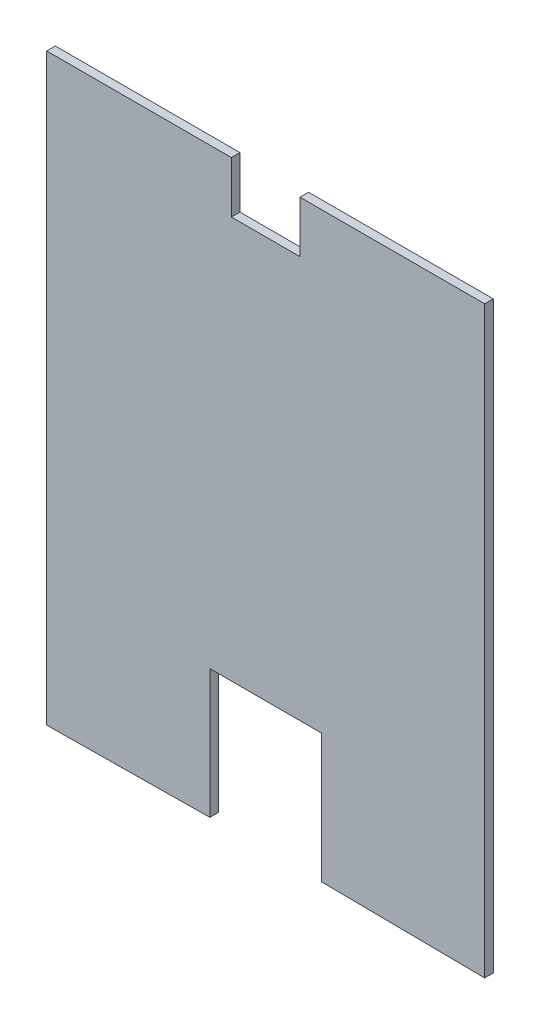
ISO-10303-21;
HEADER;
FILE_DESCRIPTION(('STEP AP214'),'2;1');
FILE_NAME('part.step','',(''),(''),'','','');
FILE_SCHEMA(('AUTOMOTIVE_DESIGN { 1 0 10303 214 1 1 1 1 }'));
ENDSEC;
DATA;
#1=APPLICATION_CONTEXT('core data for automotive mechanical design processes');
#2=APPLICATION_PROTOCOL_DEFINITION('international standard','automotive_design',2000,#1);
#3=PRODUCT_CONTEXT('',#1,'mechanical');
#4=PRODUCT('Part','Part','',(#3));
#5=PRODUCT_RELATED_PRODUCT_CATEGORY('part','',(#4));
#6=PRODUCT_DEFINITION_FORMATION('','',#4);
#7=PRODUCT_DEFINITION_CONTEXT('part definition',#1,'design');
#8=PRODUCT_DEFINITION('design','',#6,#7);
#9=PRODUCT_DEFINITION_SHAPE('','',#8);
#10=(LENGTH_UNIT() NAMED_UNIT(*) SI_UNIT(.MILLI.,.METRE.));
#11=(NAMED_UNIT(*) PLANE_ANGLE_UNIT() SI_UNIT($,.RADIAN.));
#12=(NAMED_UNIT(*) SI_UNIT($,.STERADIAN.) SOLID_ANGLE_UNIT());
#13=UNCERTAINTY_MEASURE_WITH_UNIT(LENGTH_MEASURE(1.E-05),#10,'distance_accuracy_value','');
#14=(GEOMETRIC_REPRESENTATION_CONTEXT(3) GLOBAL_UNCERTAINTY_ASSIGNED_CONTEXT((#13)) GLOBAL_UNIT_ASSIGNED_CONTEXT((#10,
#11,#12)) REPRESENTATION_CONTEXT('',''));
#15=CARTESIAN_POINT('',(0.,0.,0.));
#16=DIRECTION('',(0.,0.,1.));
#17=DIRECTION('',(1.,0.,0.));
#18=AXIS2_PLACEMENT_3D('',#15,#16,#17);
#19=CARTESIAN_POINT('',(-485.570077518931,85.6138901487541,4.99999999999991));
#20=DIRECTION('',(1.,0.,0.));
#21=DIRECTION('',(0.,0.,-1.));
#22=AXIS2_PLACEMENT_3D('',#19,#20,#21);
#23=PLANE('',#22);
#24=DIRECTION('',(0.,-1.,0.));
#25=VECTOR('',#24,1.);
#26=CARTESIAN_POINT('',(-485.570077518931,85.6138901487541,0.));
#27=LINE('',#26,#25);
#28=CARTESIAN_POINT('',(-485.570077518931,85.6138901487541,0.));
#29=VERTEX_POINT('',#28);
#30=CARTESIAN_POINT('',(-485.570077518931,-254.386109851245,0.));
#31=VERTEX_POINT('',#30);
#32=EDGE_CURVE('E153',#29,#31,#27,.T.);
#33=ORIENTED_EDGE('',*,*,#32,.T.);
#34=DIRECTION('',(0.,0.,-1.));
#35=VECTOR('',#34,1.);
#36=CARTESIAN_POINT('',(-485.570077518931,-254.386109851245,4.99999999999991));
#37=LINE('',#36,#35);
#38=CARTESIAN_POINT('',(-485.570077518931,-254.386109851245,4.99999999999991));
#39=VERTEX_POINT('',#38);
#40=EDGE_CURVE('E11',#39,#31,#37,.T.);
#41=ORIENTED_EDGE('',*,*,#40,.F.);
#42=DIRECTION('',(0.,-1.,0.));
#43=VECTOR('',#42,1.);
#44=CARTESIAN_POINT('',(-485.570077518931,85.6138901487541,4.99999999999991));
#45=LINE('',#44,#43);
#46=CARTESIAN_POINT('',(-485.570077518931,85.6138901487541,4.99999999999991));
#47=VERTEX_POINT('',#46);
#48=EDGE_CURVE('E175',#47,#39,#45,.T.);
#49=ORIENTED_EDGE('',*,*,#48,.F.);
#50=DIRECTION('',(0.,0.,-1.));
#51=VECTOR('',#50,1.);
#52=CARTESIAN_POINT('',(-485.570077518931,85.6138901487541,4.99999999999991));
#53=LINE('',#52,#51);
#54=EDGE_CURVE('E149',#47,#29,#53,.T.);
#55=ORIENTED_EDGE('',*,*,#54,.T.);
#56=EDGE_LOOP('',(#33,#41,#49,#55));
#57=FACE_BOUND('',#56,.T.);
#58=ADVANCED_FACE('F33',(#57),#23,.F.);
#59=CARTESIAN_POINT('',(-485.570077518931,-254.386109851245,4.99999999999991));
#60=DIRECTION('',(-0.0105257326625402,0.999944602941541,0.));
#61=DIRECTION('',(-0.999944602941541,-0.0105257326625402,0.));
#62=AXIS2_PLACEMENT_3D('',#59,#60,#61);
#63=PLANE('',#62);
#64=DIRECTION('',(0.999944602941541,0.0105257326625402,0.));
#65=VECTOR('',#64,1.);
#66=CARTESIAN_POINT('',(-485.570077518931,-254.386109851245,0.));
#67=LINE('',#66,#65);
#68=CARTESIAN_POINT('',(-390.570077518931,-253.386109851245,0.));
#69=VERTEX_POINT('',#68);
#70=EDGE_CURVE('E156',#31,#69,#67,.T.);
#71=ORIENTED_EDGE('',*,*,#70,.T.);
#72=DIRECTION('',(0.,0.,-1.));
#73=VECTOR('',#72,1.);
#74=CARTESIAN_POINT('',(-390.570077518931,-253.386109851245,4.99999999999991));
#75=LINE('',#74,#73);
#76=CARTESIAN_POINT('',(-390.570077518931,-253.386109851245,4.99999999999991));
#77=VERTEX_POINT('',#76);
#78=EDGE_CURVE('E41',#77,#69,#75,.T.);
#79=ORIENTED_EDGE('',*,*,#78,.F.);
#80=DIRECTION('',(0.999944602941541,0.0105257326625402,0.));
#81=VECTOR('',#80,1.);
#82=CARTESIAN_POINT('',(-485.570077518931,-254.386109851245,4.99999999999991));
#83=LINE('',#82,#81);
#84=EDGE_CURVE('E104',#39,#77,#83,.T.);
#85=ORIENTED_EDGE('',*,*,#84,.F.);
#86=ORIENTED_EDGE('',*,*,#40,.T.);
#87=EDGE_LOOP('',(#71,#79,#85,#86));
#88=FACE_BOUND('',#87,.T.);
#89=ADVANCED_FACE('F253',(#88),#63,.F.);
#90=CARTESIAN_POINT('',(-390.570077518931,-253.386109851245,4.99999999999991));
#91=DIRECTION('',(-1.,0.,0.));
#92=DIRECTION('',(0.,0.,1.));
#93=AXIS2_PLACEMENT_3D('',#90,#91,#92);
#94=PLANE('',#93);
#95=DIRECTION('',(0.,1.,0.));
#96=VECTOR('',#95,1.);
#97=CARTESIAN_POINT('',(-390.570077518931,-253.386109851245,0.));
#98=LINE('',#97,#96);
#99=CARTESIAN_POINT('',(-390.570077518931,-178.386109851245,0.));
#100=VERTEX_POINT('',#99);
#101=EDGE_CURVE('E158',#69,#100,#98,.T.);
#102=ORIENTED_EDGE('',*,*,#101,.T.);
#103=DIRECTION('',(0.,0.,-1.));
#104=VECTOR('',#103,1.);
#105=CARTESIAN_POINT('',(-390.570077518931,-178.386109851245,4.99999999999991));
#106=LINE('',#105,#104);
#107=CARTESIAN_POINT('',(-390.570077518931,-178.386109851245,4.99999999999991));
#108=VERTEX_POINT('',#107);
#109=EDGE_CURVE('E194',#108,#100,#106,.T.);
#110=ORIENTED_EDGE('',*,*,#109,.F.);
#111=DIRECTION('',(0.,1.,0.));
#112=VECTOR('',#111,1.);
#113=CARTESIAN_POINT('',(-390.570077518931,-253.386109851245,4.99999999999991));
#114=LINE('',#113,#112);
#115=EDGE_CURVE('E202',#77,#108,#114,.T.);
#116=ORIENTED_EDGE('',*,*,#115,.F.);
#117=ORIENTED_EDGE('',*,*,#78,.T.);
#118=EDGE_LOOP('',(#102,#110,#116,#117));
#119=FACE_BOUND('',#118,.T.);
#120=ADVANCED_FACE('F200',(#119),#94,.F.);
#121=CARTESIAN_POINT('',(-390.570077518931,-178.386109851245,4.99999999999991));
#122=DIRECTION('',(0.,1.,0.));
#123=DIRECTION('',(0.,0.,1.));
#124=AXIS2_PLACEMENT_3D('',#121,#122,#123);
#125=PLANE('',#124);
#126=DIRECTION('',(1.,0.,0.));
#127=VECTOR('',#126,1.);
#128=CARTESIAN_POINT('',(-390.570077518931,-178.386109851245,0.));
#129=LINE('',#128,#127);
#130=CARTESIAN_POINT('',(-325.570077518931,-178.386109851245,0.));
#131=VERTEX_POINT('',#130);
#132=EDGE_CURVE('E160',#100,#131,#129,.T.);
#133=ORIENTED_EDGE('',*,*,#132,.T.);
#134=DIRECTION('',(0.,0.,-1.));
#135=VECTOR('',#134,1.);
#136=CARTESIAN_POINT('',(-325.570077518931,-178.386109851245,4.99999999999991));
#137=LINE('',#136,#135);
#138=CARTESIAN_POINT('',(-325.570077518931,-178.386109851245,4.99999999999991));
#139=VERTEX_POINT('',#138);
#140=EDGE_CURVE('E191',#139,#131,#137,.T.);
#141=ORIENTED_EDGE('',*,*,#140,.F.);
#142=DIRECTION('',(1.,0.,0.));
#143=VECTOR('',#142,1.);
#144=CARTESIAN_POINT('',(-390.570077518931,-178.386109851245,4.99999999999991));
#145=LINE('',#144,#143);
#146=EDGE_CURVE('E220',#108,#139,#145,.T.);
#147=ORIENTED_EDGE('',*,*,#146,.F.);
#148=ORIENTED_EDGE('',*,*,#109,.T.);
#149=EDGE_LOOP('',(#133,#141,#147,#148));
#150=FACE_BOUND('',#149,.T.);
#151=ADVANCED_FACE('F211',(#150),#125,.F.);
#152=CARTESIAN_POINT('',(-325.570077518931,-178.386109851245,4.99999999999991));
#153=DIRECTION('',(1.,0.,0.));
#154=DIRECTION('',(0.,0.,-1.));
#155=AXIS2_PLACEMENT_3D('',#152,#153,#154);
#156=PLANE('',#155);
#157=DIRECTION('',(0.,-1.,0.));
#158=VECTOR('',#157,1.);
#159=CARTESIAN_POINT('',(-325.570077518931,-178.386109851245,0.));
#160=LINE('',#159,#158);
#161=CARTESIAN_POINT('',(-325.570077518931,-253.386109851245,0.));
#162=VERTEX_POINT('',#161);
#163=EDGE_CURVE('E162',#131,#162,#160,.T.);
#164=ORIENTED_EDGE('',*,*,#163,.T.);
#165=DIRECTION('',(0.,0.,-1.));
#166=VECTOR('',#165,1.);
#167=CARTESIAN_POINT('',(-325.570077518931,-253.386109851245,4.99999999999991));
#168=LINE('',#167,#166);
#169=CARTESIAN_POINT('',(-325.570077518931,-253.386109851245,4.99999999999991));
#170=VERTEX_POINT('',#169);
#171=EDGE_CURVE('E188',#170,#162,#168,.T.);
#172=ORIENTED_EDGE('',*,*,#171,.F.);
#173=DIRECTION('',(0.,-1.,0.));
#174=VECTOR('',#173,1.);
#175=CARTESIAN_POINT('',(-325.570077518931,-178.386109851245,4.99999999999991));
#176=LINE('',#175,#174);
#177=EDGE_CURVE('E217',#139,#170,#176,.T.);
#178=ORIENTED_EDGE('',*,*,#177,.F.);
#179=ORIENTED_EDGE('',*,*,#140,.T.);
#180=EDGE_LOOP('',(#164,#172,#178,#179));
#181=FACE_BOUND('',#180,.T.);
#182=ADVANCED_FACE('F215',(#181),#156,.F.);
#183=CARTESIAN_POINT('',(-325.570077518931,-253.386109851245,4.99999999999991));
#184=DIRECTION('',(0.0105257326625399,0.999944602941541,0.));
#185=DIRECTION('',(-0.999944602941541,0.0105257326625399,0.));
#186=AXIS2_PLACEMENT_3D('',#183,#184,#185);
#187=PLANE('',#186);
#188=DIRECTION('',(0.999944602941541,-0.0105257326625399,0.));
#189=VECTOR('',#188,1.);
#190=CARTESIAN_POINT('',(-325.570077518931,-253.386109851245,0.));
#191=LINE('',#190,#189);
#192=CARTESIAN_POINT('',(-230.570077518928,-254.386109851245,0.));
#193=VERTEX_POINT('',#192);
#194=EDGE_CURVE('E164',#162,#193,#191,.T.);
#195=ORIENTED_EDGE('',*,*,#194,.T.);
#196=DIRECTION('',(0.,0.,-1.));
#197=VECTOR('',#196,1.);
#198=CARTESIAN_POINT('',(-230.570077518928,-254.386109851245,4.99999999999991));
#199=LINE('',#198,#197);
#200=CARTESIAN_POINT('',(-230.570077518928,-254.386109851245,4.99999999999991));
#201=VERTEX_POINT('',#200);
#202=EDGE_CURVE('E185',#201,#193,#199,.T.);
#203=ORIENTED_EDGE('',*,*,#202,.F.);
#204=DIRECTION('',(0.999944602941541,-0.0105257326625399,0.));
#205=VECTOR('',#204,1.);
#206=CARTESIAN_POINT('',(-325.570077518931,-253.386109851245,4.99999999999991));
#207=LINE('',#206,#205);
#208=EDGE_CURVE('E219',#170,#201,#207,.T.);
#209=ORIENTED_EDGE('',*,*,#208,.F.);
#210=ORIENTED_EDGE('',*,*,#171,.T.);
#211=EDGE_LOOP('',(#195,#203,#209,#210));
#212=FACE_BOUND('',#211,.T.);
#213=ADVANCED_FACE('F266',(#212),#187,.F.);
#214=CARTESIAN_POINT('',(-230.570077518928,-254.386109851245,4.99999999999991));
#215=DIRECTION('',(-1.,0.,0.));
#216=DIRECTION('',(0.,0.,1.));
#217=AXIS2_PLACEMENT_3D('',#214,#215,#216);
#218=PLANE('',#217);
#219=DIRECTION('',(0.,1.,0.));
#220=VECTOR('',#219,1.);
#221=CARTESIAN_POINT('',(-230.570077518928,-254.386109851245,0.));
#222=LINE('',#221,#220);
#223=CARTESIAN_POINT('',(-230.570077518928,85.6138901487541,0.));
#224=VERTEX_POINT('',#223);
#225=EDGE_CURVE('E166',#193,#224,#222,.T.);
#226=ORIENTED_EDGE('',*,*,#225,.T.);
#227=DIRECTION('',(0.,0.,-1.));
#228=VECTOR('',#227,1.);
#229=CARTESIAN_POINT('',(-230.570077518928,85.6138901487541,4.99999999999991));
#230=LINE('',#229,#228);
#231=CARTESIAN_POINT('',(-230.570077518928,85.6138901487541,4.99999999999991));
#232=VERTEX_POINT('',#231);
#233=EDGE_CURVE('E182',#232,#224,#230,.T.);
#234=ORIENTED_EDGE('',*,*,#233,.F.);
#235=DIRECTION('',(0.,1.,0.));
#236=VECTOR('',#235,1.);
#237=CARTESIAN_POINT('',(-230.570077518928,-254.386109851245,4.99999999999991));
#238=LINE('',#237,#236);
#239=EDGE_CURVE('E222',#201,#232,#238,.T.);
#240=ORIENTED_EDGE('',*,*,#239,.F.);
#241=ORIENTED_EDGE('',*,*,#202,.T.);
#242=EDGE_LOOP('',(#226,#234,#240,#241));
#243=FACE_BOUND('',#242,.T.);
#244=ADVANCED_FACE('F269',(#243),#218,.F.);
#245=CARTESIAN_POINT('',(-230.570077518928,85.6138901487541,4.99999999999991));
#246=DIRECTION('',(0.,-1.,0.));
#247=DIRECTION('',(1.,0.,0.));
#248=AXIS2_PLACEMENT_3D('',#245,#246,#247);
#249=PLANE('',#248);
#250=DIRECTION('',(-1.,0.,0.));
#251=VECTOR('',#250,1.);
#252=CARTESIAN_POINT('',(-230.570077518928,85.6138901487541,0.));
#253=LINE('',#252,#251);
#254=CARTESIAN_POINT('',(-338.07007751893,85.613890148754,0.));
#255=VERTEX_POINT('',#254);
#256=EDGE_CURVE('E168',#224,#255,#253,.T.);
#257=ORIENTED_EDGE('',*,*,#256,.T.);
#258=DIRECTION('',(0.,0.,-1.));
#259=VECTOR('',#258,1.);
#260=CARTESIAN_POINT('',(-338.07007751893,85.613890148754,4.99999999999991));
#261=LINE('',#260,#259);
#262=CARTESIAN_POINT('',(-338.07007751893,85.613890148754,4.99999999999991));
#263=VERTEX_POINT('',#262);
#264=EDGE_CURVE('E179',#263,#255,#261,.T.);
#265=ORIENTED_EDGE('',*,*,#264,.F.);
#266=DIRECTION('',(-1.,0.,0.));
#267=VECTOR('',#266,1.);
#268=CARTESIAN_POINT('',(-230.570077518928,85.6138901487541,4.99999999999991));
#269=LINE('',#268,#267);
#270=EDGE_CURVE('E228',#232,#263,#269,.T.);
#271=ORIENTED_EDGE('',*,*,#270,.F.);
#272=ORIENTED_EDGE('',*,*,#233,.T.);
#273=EDGE_LOOP('',(#257,#265,#271,#272));
#274=FACE_BOUND('',#273,.T.);
#275=ADVANCED_FACE('F234',(#274),#249,.F.);
#276=CARTESIAN_POINT('',(-338.07007751893,85.613890148754,4.99999999999991));
#277=DIRECTION('',(1.,0.,0.));
#278=DIRECTION('',(0.,1.,0.));
#279=AXIS2_PLACEMENT_3D('',#276,#277,#278);
#280=PLANE('',#279);
#281=DIRECTION('',(0.,-1.,0.));
#282=VECTOR('',#281,1.);
#283=CARTESIAN_POINT('',(-338.07007751893,85.613890148754,0.));
#284=LINE('',#283,#282);
#285=CARTESIAN_POINT('',(-338.07007751893,55.6138901487541,0.));
#286=VERTEX_POINT('',#285);
#287=EDGE_CURVE('E170',#255,#286,#284,.T.);
#288=ORIENTED_EDGE('',*,*,#287,.T.);
#289=DIRECTION('',(0.,0.,-1.));
#290=VECTOR('',#289,1.);
#291=CARTESIAN_POINT('',(-338.07007751893,55.6138901487541,4.99999999999991));
#292=LINE('',#291,#290);
#293=CARTESIAN_POINT('',(-338.07007751893,55.6138901487541,4.99999999999991));
#294=VERTEX_POINT('',#293);
#295=EDGE_CURVE('E144',#294,#286,#292,.T.);
#296=ORIENTED_EDGE('',*,*,#295,.F.);
#297=DIRECTION('',(0.,-1.,0.));
#298=VECTOR('',#297,1.);
#299=CARTESIAN_POINT('',(-338.07007751893,85.613890148754,4.99999999999991));
#300=LINE('',#299,#298);
#301=EDGE_CURVE('E135',#263,#294,#300,.T.);
#302=ORIENTED_EDGE('',*,*,#301,.F.);
#303=ORIENTED_EDGE('',*,*,#264,.T.);
#304=EDGE_LOOP('',(#288,#296,#302,#303));
#305=FACE_BOUND('',#304,.T.);
#306=ADVANCED_FACE('F238',(#305),#280,.F.);
#307=CARTESIAN_POINT('',(-338.07007751893,55.6138901487541,4.99999999999991));
#308=DIRECTION('',(0.,-1.,0.));
#309=DIRECTION('',(0.,0.,-1.));
#310=AXIS2_PLACEMENT_3D('',#307,#308,#309);
#311=PLANE('',#310);
#312=DIRECTION('',(-1.,0.,0.));
#313=VECTOR('',#312,1.);
#314=CARTESIAN_POINT('',(-338.07007751893,55.6138901487541,0.));
#315=LINE('',#314,#313);
#316=CARTESIAN_POINT('',(-378.07007751893,55.6138901487541,0.));
#317=VERTEX_POINT('',#316);
#318=EDGE_CURVE('E143',#286,#317,#315,.T.);
#319=ORIENTED_EDGE('',*,*,#318,.T.);
#320=DIRECTION('',(0.,0.,-1.));
#321=VECTOR('',#320,1.);
#322=CARTESIAN_POINT('',(-378.07007751893,55.6138901487541,4.99999999999991));
#323=LINE('',#322,#321);
#324=CARTESIAN_POINT('',(-378.07007751893,55.6138901487541,4.99999999999991));
#325=VERTEX_POINT('',#324);
#326=EDGE_CURVE('E140',#325,#317,#323,.T.);
#327=ORIENTED_EDGE('',*,*,#326,.F.);
#328=DIRECTION('',(-1.,0.,0.));
#329=VECTOR('',#328,1.);
#330=CARTESIAN_POINT('',(-338.07007751893,55.6138901487541,4.99999999999991));
#331=LINE('',#330,#329);
#332=EDGE_CURVE('E129',#294,#325,#331,.T.);
#333=ORIENTED_EDGE('',*,*,#332,.F.);
#334=ORIENTED_EDGE('',*,*,#295,.T.);
#335=EDGE_LOOP('',(#319,#327,#333,#334));
#336=FACE_BOUND('',#335,.T.);
#337=ADVANCED_FACE('F141',(#336),#311,.F.);
#338=CARTESIAN_POINT('',(-378.07007751893,55.6138901487541,4.99999999999991));
#339=DIRECTION('',(-1.,0.,0.));
#340=DIRECTION('',(0.,0.,1.));
#341=AXIS2_PLACEMENT_3D('',#338,#339,#340);
#342=PLANE('',#341);
#343=DIRECTION('',(0.,1.,0.));
#344=VECTOR('',#343,1.);
#345=CARTESIAN_POINT('',(-378.07007751893,55.6138901487541,0.));
#346=LINE('',#345,#344);
#347=CARTESIAN_POINT('',(-378.07007751893,85.6138901487541,0.));
#348=VERTEX_POINT('',#347);
#349=EDGE_CURVE('E90',#317,#348,#346,.T.);
#350=ORIENTED_EDGE('',*,*,#349,.T.);
#351=DIRECTION('',(0.,0.,-1.));
#352=VECTOR('',#351,1.);
#353=CARTESIAN_POINT('',(-378.07007751893,85.6138901487541,4.99999999999991));
#354=LINE('',#353,#352);
#355=CARTESIAN_POINT('',(-378.07007751893,85.6138901487541,4.99999999999991));
#356=VERTEX_POINT('',#355);
#357=EDGE_CURVE('E145',#356,#348,#354,.T.);
#358=ORIENTED_EDGE('',*,*,#357,.F.);
#359=DIRECTION('',(0.,1.,0.));
#360=VECTOR('',#359,1.);
#361=CARTESIAN_POINT('',(-378.07007751893,55.6138901487541,4.99999999999991));
#362=LINE('',#361,#360);
#363=EDGE_CURVE('E133',#325,#356,#362,.T.);
#364=ORIENTED_EDGE('',*,*,#363,.F.);
#365=ORIENTED_EDGE('',*,*,#326,.T.);
#366=EDGE_LOOP('',(#350,#358,#364,#365));
#367=FACE_BOUND('',#366,.T.);
#368=ADVANCED_FACE('F147',(#367),#342,.F.);
#369=CARTESIAN_POINT('',(-378.07007751893,85.6138901487541,4.99999999999991));
#370=DIRECTION('',(0.,-1.,0.));
#371=DIRECTION('',(0.,0.,-1.));
#372=AXIS2_PLACEMENT_3D('',#369,#370,#371);
#373=PLANE('',#372);
#374=DIRECTION('',(-1.,0.,0.));
#375=VECTOR('',#374,1.);
#376=CARTESIAN_POINT('',(-378.07007751893,85.6138901487541,0.));
#377=LINE('',#376,#375);
#378=EDGE_CURVE('E96',#348,#29,#377,.T.);
#379=ORIENTED_EDGE('',*,*,#378,.T.);
#380=ORIENTED_EDGE('',*,*,#54,.F.);
#381=DIRECTION('',(-1.,0.,0.));
#382=VECTOR('',#381,1.);
#383=CARTESIAN_POINT('',(-378.07007751893,85.6138901487541,4.99999999999991));
#384=LINE('',#383,#382);
#385=EDGE_CURVE('E49',#356,#47,#384,.T.);
#386=ORIENTED_EDGE('',*,*,#385,.F.);
#387=ORIENTED_EDGE('',*,*,#357,.T.);
#388=EDGE_LOOP('',(#379,#380,#386,#387));
#389=FACE_BOUND('',#388,.T.);
#390=ADVANCED_FACE('F242',(#389),#373,.F.);
#391=CARTESIAN_POINT('',(0.,0.,4.99999999999991));
#392=DIRECTION('',(0.,0.,1.));
#393=DIRECTION('',(1.,0.,0.));
#394=AXIS2_PLACEMENT_3D('',#391,#392,#393);
#395=PLANE('',#394);
#396=ORIENTED_EDGE('',*,*,#48,.T.);
#397=ORIENTED_EDGE('',*,*,#84,.T.);
#398=ORIENTED_EDGE('',*,*,#115,.T.);
#399=ORIENTED_EDGE('',*,*,#146,.T.);
#400=ORIENTED_EDGE('',*,*,#177,.T.);
#401=ORIENTED_EDGE('',*,*,#208,.T.);
#402=ORIENTED_EDGE('',*,*,#239,.T.);
#403=ORIENTED_EDGE('',*,*,#270,.T.);
#404=ORIENTED_EDGE('',*,*,#301,.T.);
#405=ORIENTED_EDGE('',*,*,#332,.T.);
#406=ORIENTED_EDGE('',*,*,#363,.T.);
#407=ORIENTED_EDGE('',*,*,#385,.T.);
#408=EDGE_LOOP('',(#396,#397,#398,#399,#400,#401,#402,#403,#404,#405,#406,#407));
#409=FACE_BOUND('',#408,.T.);
#410=ADVANCED_FACE('F131',(#409),#395,.T.);
#411=CARTESIAN_POINT('',(0.,0.,0.));
#412=DIRECTION('',(0.,0.,1.));
#413=DIRECTION('',(1.,0.,0.));
#414=AXIS2_PLACEMENT_3D('',#411,#412,#413);
#415=PLANE('',#414);
#416=ORIENTED_EDGE('',*,*,#32,.F.);
#417=ORIENTED_EDGE('',*,*,#378,.F.);
#418=ORIENTED_EDGE('',*,*,#349,.F.);
#419=ORIENTED_EDGE('',*,*,#318,.F.);
#420=ORIENTED_EDGE('',*,*,#287,.F.);
#421=ORIENTED_EDGE('',*,*,#256,.F.);
#422=ORIENTED_EDGE('',*,*,#225,.F.);
#423=ORIENTED_EDGE('',*,*,#194,.F.);
#424=ORIENTED_EDGE('',*,*,#163,.F.);
#425=ORIENTED_EDGE('',*,*,#132,.F.);
#426=ORIENTED_EDGE('',*,*,#101,.F.);
#427=ORIENTED_EDGE('',*,*,#70,.F.);
#428=EDGE_LOOP('',(#416,#417,#418,#419,#420,#421,#422,#423,#424,#425,#426,#427));
#429=FACE_BOUND('',#428,.T.);
#430=ADVANCED_FACE('F206',(#429),#415,.F.);
#431=CLOSED_SHELL('',(#58,#89,#120,#151,#182,#213,#244,#275,#306,#337,#368,#390,#410,#430));
#432=MANIFOLD_SOLID_BREP('B2',#431);
#433=ADVANCED_BREP_SHAPE_REPRESENTATION('',(#18,#432),#14);
#434=SHAPE_DEFINITION_REPRESENTATION(#9,#433);
ENDSEC;
END-ISO-10303-21;
